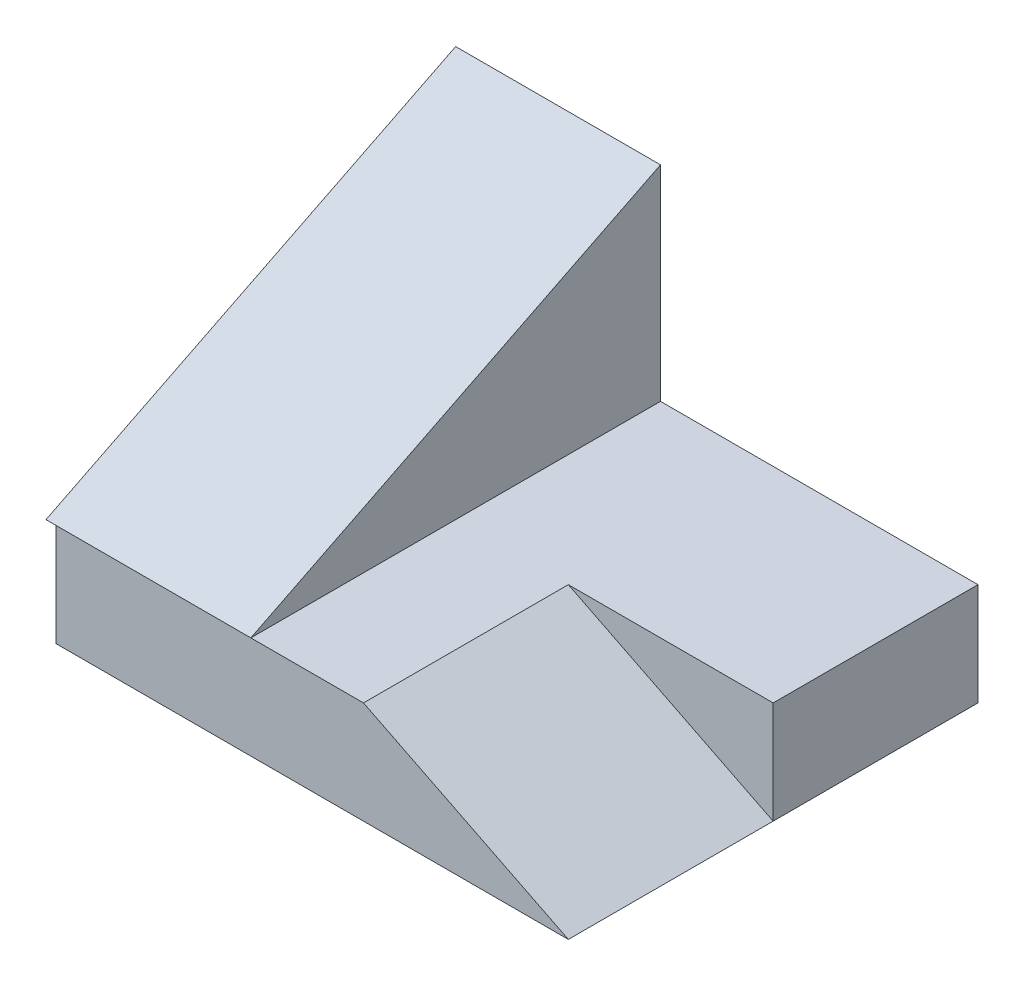
ISO-10303-21;
HEADER;
FILE_DESCRIPTION(('STEP AP214'),'2;1');
FILE_NAME('part.step','',(''),(''),'','','');
FILE_SCHEMA(('AUTOMOTIVE_DESIGN { 1 0 10303 214 1 1 1 1 }'));
ENDSEC;
DATA;
#1=APPLICATION_CONTEXT('core data for automotive mechanical design processes');
#2=APPLICATION_PROTOCOL_DEFINITION('international standard','automotive_design',2000,#1);
#3=PRODUCT_CONTEXT('',#1,'mechanical');
#4=PRODUCT('Part','Part','',(#3));
#5=PRODUCT_RELATED_PRODUCT_CATEGORY('part','',(#4));
#6=PRODUCT_DEFINITION_FORMATION('','',#4);
#7=PRODUCT_DEFINITION_CONTEXT('part definition',#1,'design');
#8=PRODUCT_DEFINITION('design','',#6,#7);
#9=PRODUCT_DEFINITION_SHAPE('','',#8);
#10=(LENGTH_UNIT() NAMED_UNIT(*) SI_UNIT(.MILLI.,.METRE.));
#11=(NAMED_UNIT(*) PLANE_ANGLE_UNIT() SI_UNIT($,.RADIAN.));
#12=(NAMED_UNIT(*) SI_UNIT($,.STERADIAN.) SOLID_ANGLE_UNIT());
#13=UNCERTAINTY_MEASURE_WITH_UNIT(LENGTH_MEASURE(1.E-05),#10,'distance_accuracy_value','');
#14=(GEOMETRIC_REPRESENTATION_CONTEXT(3) GLOBAL_UNCERTAINTY_ASSIGNED_CONTEXT((#13)) GLOBAL_UNIT_ASSIGNED_CONTEXT((#10,
#11,#12)) REPRESENTATION_CONTEXT('',''));
#15=CARTESIAN_POINT('',(0.,0.,0.));
#16=DIRECTION('',(0.,0.,1.));
#17=DIRECTION('',(1.,0.,0.));
#18=AXIS2_PLACEMENT_3D('',#15,#16,#17);
#19=CARTESIAN_POINT('',(127.,25.4,0.));
#20=DIRECTION('',(-1.,0.,0.));
#21=DIRECTION('',(0.,0.,1.));
#22=AXIS2_PLACEMENT_3D('',#19,#20,#21);
#23=PLANE('',#22);
#24=DIRECTION('',(0.,1.,0.));
#25=VECTOR('',#24,1.);
#26=CARTESIAN_POINT('',(127.,25.4,-50.8));
#27=LINE('',#26,#25);
#28=CARTESIAN_POINT('',(127.,0.,-50.8));
#29=VERTEX_POINT('',#28);
#30=CARTESIAN_POINT('',(127.,25.4,-50.8));
#31=VERTEX_POINT('',#30);
#32=EDGE_CURVE('E81',#29,#31,#27,.T.);
#33=ORIENTED_EDGE('',*,*,#32,.F.);
#34=DIRECTION('',(0.,0.,-1.));
#35=VECTOR('',#34,1.);
#36=CARTESIAN_POINT('',(127.,0.,0.));
#37=LINE('',#36,#35);
#38=CARTESIAN_POINT('',(127.,0.,-101.6));
#39=VERTEX_POINT('',#38);
#40=EDGE_CURVE('E77',#29,#39,#37,.T.);
#41=ORIENTED_EDGE('',*,*,#40,.T.);
#42=DIRECTION('',(0.,-1.,0.));
#43=VECTOR('',#42,1.);
#44=CARTESIAN_POINT('',(127.,25.4,-101.6));
#45=LINE('',#44,#43);
#46=CARTESIAN_POINT('',(127.,25.4,-101.6));
#47=VERTEX_POINT('',#46);
#48=EDGE_CURVE('E42',#47,#39,#45,.T.);
#49=ORIENTED_EDGE('',*,*,#48,.F.);
#50=DIRECTION('',(0.,0.,-1.));
#51=VECTOR('',#50,1.);
#52=CARTESIAN_POINT('',(127.,25.4,0.));
#53=LINE('',#52,#51);
#54=EDGE_CURVE('E58',#31,#47,#53,.T.);
#55=ORIENTED_EDGE('',*,*,#54,.F.);
#56=EDGE_LOOP('',(#33,#41,#49,#55));
#57=FACE_BOUND('',#56,.T.);
#58=ADVANCED_FACE('F33',(#57),#23,.F.);
#59=CARTESIAN_POINT('',(0.,25.4,0.));
#60=DIRECTION('',(1.,0.,0.));
#61=DIRECTION('',(0.,0.,-1.));
#62=AXIS2_PLACEMENT_3D('',#59,#60,#61);
#63=PLANE('',#62);
#64=DIRECTION('',(0.,0.,1.));
#65=VECTOR('',#64,1.);
#66=CARTESIAN_POINT('',(0.,0.,0.));
#67=LINE('',#66,#65);
#68=CARTESIAN_POINT('',(0.,0.,-101.6));
#69=VERTEX_POINT('',#68);
#70=CARTESIAN_POINT('',(0.,0.,0.));
#71=VERTEX_POINT('',#70);
#72=EDGE_CURVE('E100',#69,#71,#67,.T.);
#73=ORIENTED_EDGE('',*,*,#72,.T.);
#74=DIRECTION('',(0.,-1.,0.));
#75=VECTOR('',#74,1.);
#76=CARTESIAN_POINT('',(0.,25.4,0.));
#77=LINE('',#76,#75);
#78=CARTESIAN_POINT('',(0.,25.4,0.));
#79=VERTEX_POINT('',#78);
#80=EDGE_CURVE('E11',#79,#71,#77,.T.);
#81=ORIENTED_EDGE('',*,*,#80,.F.);
#82=DIRECTION('',(0.,0.,1.));
#83=VECTOR('',#82,1.);
#84=CARTESIAN_POINT('',(0.,25.4,0.));
#85=LINE('',#84,#83);
#86=CARTESIAN_POINT('',(0.,25.4,-101.6));
#87=VERTEX_POINT('',#86);
#88=EDGE_CURVE('E101',#87,#79,#85,.T.);
#89=ORIENTED_EDGE('',*,*,#88,.F.);
#90=DIRECTION('',(0.,-1.,0.));
#91=VECTOR('',#90,1.);
#92=CARTESIAN_POINT('',(0.,25.4,-101.6));
#93=LINE('',#92,#91);
#94=EDGE_CURVE('E95',#87,#69,#93,.T.);
#95=ORIENTED_EDGE('',*,*,#94,.T.);
#96=EDGE_LOOP('',(#73,#81,#89,#95));
#97=FACE_BOUND('',#96,.T.);
#98=ADVANCED_FACE('F35',(#97),#63,.F.);
#99=CARTESIAN_POINT('',(0.,25.4,0.));
#100=DIRECTION('',(0.,0.,-1.));
#101=DIRECTION('',(-1.,0.,0.));
#102=AXIS2_PLACEMENT_3D('',#99,#100,#101);
#103=PLANE('',#102);
#104=DIRECTION('',(1.,0.,0.));
#105=VECTOR('',#104,1.);
#106=CARTESIAN_POINT('',(0.,0.,0.));
#107=LINE('',#106,#105);
#108=CARTESIAN_POINT('',(127.,0.,0.));
#109=VERTEX_POINT('',#108);
#110=EDGE_CURVE('E86',#71,#109,#107,.T.);
#111=ORIENTED_EDGE('',*,*,#110,.T.);
#112=DIRECTION('',(0.894427190999916,-0.447213595499958,0.));
#113=VECTOR('',#112,1.);
#114=CARTESIAN_POINT('',(76.2,25.4,0.));
#115=LINE('',#114,#113);
#116=CARTESIAN_POINT('',(76.2,25.4,0.));
#117=VERTEX_POINT('',#116);
#118=EDGE_CURVE('E148',#117,#109,#115,.T.);
#119=ORIENTED_EDGE('',*,*,#118,.F.);
#120=DIRECTION('',(1.,0.,0.));
#121=VECTOR('',#120,1.);
#122=CARTESIAN_POINT('',(0.,25.4,0.));
#123=LINE('',#122,#121);
#124=CARTESIAN_POINT('',(48.26,25.4,0.));
#125=VERTEX_POINT('',#124);
#126=EDGE_CURVE('E104',#125,#117,#123,.T.);
#127=ORIENTED_EDGE('',*,*,#126,.F.);
#128=EDGE_CURVE('E112',#79,#125,#123,.T.);
#129=ORIENTED_EDGE('',*,*,#128,.F.);
#130=ORIENTED_EDGE('',*,*,#80,.T.);
#131=EDGE_LOOP('',(#111,#119,#127,#129,#130));
#132=FACE_BOUND('',#131,.T.);
#133=ADVANCED_FACE('F174',(#132),#103,.F.);
#134=CARTESIAN_POINT('',(0.,25.4,-101.6));
#135=DIRECTION('',(0.,0.,1.));
#136=DIRECTION('',(1.,0.,0.));
#137=AXIS2_PLACEMENT_3D('',#134,#135,#136);
#138=PLANE('',#137);
#139=DIRECTION('',(-1.,0.,0.));
#140=VECTOR('',#139,1.);
#141=CARTESIAN_POINT('',(0.,0.,-101.6));
#142=LINE('',#141,#140);
#143=EDGE_CURVE('E91',#39,#69,#142,.T.);
#144=ORIENTED_EDGE('',*,*,#143,.T.);
#145=ORIENTED_EDGE('',*,*,#94,.F.);
#146=DIRECTION('',(-1.,0.,0.));
#147=VECTOR('',#146,1.);
#148=CARTESIAN_POINT('',(48.26,25.4,-101.6));
#149=LINE('',#148,#147);
#150=CARTESIAN_POINT('',(-2.54,25.4,-101.6));
#151=VERTEX_POINT('',#150);
#152=EDGE_CURVE('E125',#87,#151,#149,.T.);
#153=ORIENTED_EDGE('',*,*,#152,.T.);
#154=DIRECTION('',(0.,-1.,0.));
#155=VECTOR('',#154,1.);
#156=CARTESIAN_POINT('',(-2.54,25.4,-101.6));
#157=LINE('',#156,#155);
#158=CARTESIAN_POINT('',(-2.54,76.2,-101.6));
#159=VERTEX_POINT('',#158);
#160=EDGE_CURVE('E136',#159,#151,#157,.T.);
#161=ORIENTED_EDGE('',*,*,#160,.F.);
#162=DIRECTION('',(-1.,0.,0.));
#163=VECTOR('',#162,1.);
#164=CARTESIAN_POINT('',(48.26,76.2,-101.6));
#165=LINE('',#164,#163);
#166=CARTESIAN_POINT('',(48.26,76.2,-101.6));
#167=VERTEX_POINT('',#166);
#168=EDGE_CURVE('E145',#167,#159,#165,.T.);
#169=ORIENTED_EDGE('',*,*,#168,.F.);
#170=DIRECTION('',(0.,-1.,0.));
#171=VECTOR('',#170,1.);
#172=CARTESIAN_POINT('',(48.26,25.4,-101.6));
#173=LINE('',#172,#171);
#174=CARTESIAN_POINT('',(48.26,25.4,-101.6));
#175=VERTEX_POINT('',#174);
#176=EDGE_CURVE('E132',#167,#175,#173,.T.);
#177=ORIENTED_EDGE('',*,*,#176,.T.);
#178=DIRECTION('',(-1.,0.,0.));
#179=VECTOR('',#178,1.);
#180=CARTESIAN_POINT('',(0.,25.4,-101.6));
#181=LINE('',#180,#179);
#182=EDGE_CURVE('E94',#47,#175,#181,.T.);
#183=ORIENTED_EDGE('',*,*,#182,.F.);
#184=ORIENTED_EDGE('',*,*,#48,.T.);
#185=EDGE_LOOP('',(#144,#145,#153,#161,#169,#177,#183,#184));
#186=FACE_BOUND('',#185,.T.);
#187=ADVANCED_FACE('F89',(#186),#138,.F.);
#188=CARTESIAN_POINT('',(0.,25.4,0.));
#189=DIRECTION('',(0.,-1.,0.));
#190=DIRECTION('',(0.,0.,-1.));
#191=AXIS2_PLACEMENT_3D('',#188,#189,#190);
#192=PLANE('',#191);
#193=ORIENTED_EDGE('',*,*,#182,.T.);
#194=DIRECTION('',(0.,0.,1.));
#195=VECTOR('',#194,1.);
#196=CARTESIAN_POINT('',(48.26,25.4,-101.6));
#197=LINE('',#196,#195);
#198=EDGE_CURVE('E126',#175,#125,#197,.T.);
#199=ORIENTED_EDGE('',*,*,#198,.T.);
#200=ORIENTED_EDGE('',*,*,#126,.T.);
#201=DIRECTION('',(0.,0.,1.));
#202=VECTOR('',#201,1.);
#203=CARTESIAN_POINT('',(76.2,25.4,-50.8));
#204=LINE('',#203,#202);
#205=CARTESIAN_POINT('',(76.2,25.4,-50.8));
#206=VERTEX_POINT('',#205);
#207=EDGE_CURVE('E164',#206,#117,#204,.T.);
#208=ORIENTED_EDGE('',*,*,#207,.F.);
#209=DIRECTION('',(-1.,0.,0.));
#210=VECTOR('',#209,1.);
#211=CARTESIAN_POINT('',(76.2,25.4,-50.8));
#212=LINE('',#211,#210);
#213=EDGE_CURVE('E158',#31,#206,#212,.T.);
#214=ORIENTED_EDGE('',*,*,#213,.F.);
#215=ORIENTED_EDGE('',*,*,#54,.T.);
#216=EDGE_LOOP('',(#193,#199,#200,#208,#214,#215));
#217=FACE_BOUND('',#216,.T.);
#218=ADVANCED_FACE('F183',(#217),#192,.F.);
#219=CARTESIAN_POINT('',(0.,0.,0.));
#220=DIRECTION('',(0.,-1.,0.));
#221=DIRECTION('',(0.,0.,-1.));
#222=AXIS2_PLACEMENT_3D('',#219,#220,#221);
#223=PLANE('',#222);
#224=ORIENTED_EDGE('',*,*,#72,.F.);
#225=ORIENTED_EDGE('',*,*,#143,.F.);
#226=ORIENTED_EDGE('',*,*,#40,.F.);
#227=EDGE_CURVE('E85',#109,#29,#37,.T.);
#228=ORIENTED_EDGE('',*,*,#227,.F.);
#229=ORIENTED_EDGE('',*,*,#110,.F.);
#230=EDGE_LOOP('',(#224,#225,#226,#228,#229));
#231=FACE_BOUND('',#230,.T.);
#232=ADVANCED_FACE('F98',(#231),#223,.T.);
#233=CARTESIAN_POINT('',(76.2,25.4,-50.8));
#234=DIRECTION('',(-0.447213595499958,-0.894427190999916,0.));
#235=DIRECTION('',(0.894427190999916,-0.447213595499958,0.));
#236=AXIS2_PLACEMENT_3D('',#233,#234,#235);
#237=PLANE('',#236);
#238=ORIENTED_EDGE('',*,*,#118,.T.);
#239=ORIENTED_EDGE('',*,*,#227,.T.);
#240=DIRECTION('',(0.894427190999916,-0.447213595499958,0.));
#241=VECTOR('',#240,1.);
#242=CARTESIAN_POINT('',(76.2,25.4,-50.8));
#243=LINE('',#242,#241);
#244=EDGE_CURVE('E161',#206,#29,#243,.T.);
#245=ORIENTED_EDGE('',*,*,#244,.F.);
#246=ORIENTED_EDGE('',*,*,#207,.T.);
#247=EDGE_LOOP('',(#238,#239,#245,#246));
#248=FACE_BOUND('',#247,.T.);
#249=ADVANCED_FACE('F177',(#248),#237,.F.);
#250=CARTESIAN_POINT('',(0.,0.,-50.8));
#251=DIRECTION('',(0.,0.,1.));
#252=DIRECTION('',(1.,0.,0.));
#253=AXIS2_PLACEMENT_3D('',#250,#251,#252);
#254=PLANE('',#253);
#255=ORIENTED_EDGE('',*,*,#32,.T.);
#256=ORIENTED_EDGE('',*,*,#213,.T.);
#257=ORIENTED_EDGE('',*,*,#244,.T.);
#258=EDGE_LOOP('',(#255,#256,#257));
#259=FACE_BOUND('',#258,.T.);
#260=ADVANCED_FACE('F180',(#259),#254,.T.);
#261=CARTESIAN_POINT('',(48.26,76.2,-101.6));
#262=DIRECTION('',(0.,0.894427190999916,0.447213595499958));
#263=DIRECTION('',(0.,-0.447213595499958,0.894427190999916));
#264=AXIS2_PLACEMENT_3D('',#261,#262,#263);
#265=PLANE('',#264);
#266=DIRECTION('',(0.,0.447213595499958,-0.894427190999916));
#267=VECTOR('',#266,1.);
#268=CARTESIAN_POINT('',(-2.54,76.2,-101.6));
#269=LINE('',#268,#267);
#270=CARTESIAN_POINT('',(-2.54,25.4,0.));
#271=VERTEX_POINT('',#270);
#272=EDGE_CURVE('E142',#271,#159,#269,.T.);
#273=ORIENTED_EDGE('',*,*,#272,.F.);
#274=DIRECTION('',(-1.,0.,0.));
#275=VECTOR('',#274,1.);
#276=CARTESIAN_POINT('',(48.26,25.4,0.));
#277=LINE('',#276,#275);
#278=EDGE_CURVE('E149',#79,#271,#277,.T.);
#279=ORIENTED_EDGE('',*,*,#278,.F.);
#280=ORIENTED_EDGE('',*,*,#128,.T.);
#281=DIRECTION('',(0.,0.447213595499958,-0.894427190999916));
#282=VECTOR('',#281,1.);
#283=CARTESIAN_POINT('',(48.26,76.2,-101.6));
#284=LINE('',#283,#282);
#285=EDGE_CURVE('E49',#125,#167,#284,.T.);
#286=ORIENTED_EDGE('',*,*,#285,.T.);
#287=ORIENTED_EDGE('',*,*,#168,.T.);
#288=EDGE_LOOP('',(#273,#279,#280,#286,#287));
#289=FACE_BOUND('',#288,.T.);
#290=ADVANCED_FACE('F206',(#289),#265,.T.);
#291=CARTESIAN_POINT('',(48.26,25.4,-101.6));
#292=DIRECTION('',(0.,-1.,0.));
#293=DIRECTION('',(0.,0.,-1.));
#294=AXIS2_PLACEMENT_3D('',#291,#292,#293);
#295=PLANE('',#294);
#296=ORIENTED_EDGE('',*,*,#152,.F.);
#297=ORIENTED_EDGE('',*,*,#88,.T.);
#298=ORIENTED_EDGE('',*,*,#278,.T.);
#299=DIRECTION('',(0.,0.,1.));
#300=VECTOR('',#299,1.);
#301=CARTESIAN_POINT('',(-2.54,25.4,-101.6));
#302=LINE('',#301,#300);
#303=EDGE_CURVE('E139',#151,#271,#302,.T.);
#304=ORIENTED_EDGE('',*,*,#303,.F.);
#305=EDGE_LOOP('',(#296,#297,#298,#304));
#306=FACE_BOUND('',#305,.T.);
#307=ADVANCED_FACE('F210',(#306),#295,.T.);
#308=CARTESIAN_POINT('',(48.26,0.,0.));
#309=DIRECTION('',(1.,0.,0.));
#310=DIRECTION('',(0.,0.,-1.));
#311=AXIS2_PLACEMENT_3D('',#308,#309,#310);
#312=PLANE('',#311);
#313=ORIENTED_EDGE('',*,*,#176,.F.);
#314=ORIENTED_EDGE('',*,*,#285,.F.);
#315=ORIENTED_EDGE('',*,*,#198,.F.);
#316=EDGE_LOOP('',(#313,#314,#315));
#317=FACE_BOUND('',#316,.T.);
#318=ADVANCED_FACE('F202',(#317),#312,.T.);
#319=CARTESIAN_POINT('',(-2.54,0.,0.));
#320=DIRECTION('',(1.,0.,0.));
#321=DIRECTION('',(0.,0.,-1.));
#322=AXIS2_PLACEMENT_3D('',#319,#320,#321);
#323=PLANE('',#322);
#324=ORIENTED_EDGE('',*,*,#160,.T.);
#325=ORIENTED_EDGE('',*,*,#303,.T.);
#326=ORIENTED_EDGE('',*,*,#272,.T.);
#327=EDGE_LOOP('',(#324,#325,#326));
#328=FACE_BOUND('',#327,.T.);
#329=ADVANCED_FACE('F217',(#328),#323,.F.);
#330=CLOSED_SHELL('',(#58,#98,#133,#187,#218,#232,#249,#260,#290,#307,#318,#329));
#331=MANIFOLD_SOLID_BREP('B2',#330);
#332=ADVANCED_BREP_SHAPE_REPRESENTATION('',(#18,#331),#14);
#333=SHAPE_DEFINITION_REPRESENTATION(#9,#332);
ENDSEC;
END-ISO-10303-21;
